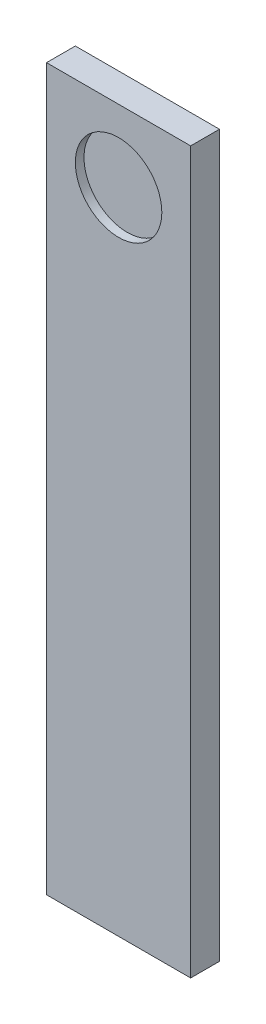
ISO-10303-21;
HEADER;
FILE_DESCRIPTION(('STEP AP214'),'2;1');
FILE_NAME('part.step','',(''),(''),'','','');
FILE_SCHEMA(('AUTOMOTIVE_DESIGN { 1 0 10303 214 1 1 1 1 }'));
ENDSEC;
DATA;
#1=APPLICATION_CONTEXT('core data for automotive mechanical design processes');
#2=APPLICATION_PROTOCOL_DEFINITION('international standard','automotive_design',2000,#1);
#3=PRODUCT_CONTEXT('',#1,'mechanical');
#4=PRODUCT('Part','Part','',(#3));
#5=PRODUCT_RELATED_PRODUCT_CATEGORY('part','',(#4));
#6=PRODUCT_DEFINITION_FORMATION('','',#4);
#7=PRODUCT_DEFINITION_CONTEXT('part definition',#1,'design');
#8=PRODUCT_DEFINITION('design','',#6,#7);
#9=PRODUCT_DEFINITION_SHAPE('','',#8);
#10=(LENGTH_UNIT() NAMED_UNIT(*) SI_UNIT(.MILLI.,.METRE.));
#11=(NAMED_UNIT(*) PLANE_ANGLE_UNIT() SI_UNIT($,.RADIAN.));
#12=(NAMED_UNIT(*) SI_UNIT($,.STERADIAN.) SOLID_ANGLE_UNIT());
#13=UNCERTAINTY_MEASURE_WITH_UNIT(LENGTH_MEASURE(1.E-05),#10,'distance_accuracy_value','');
#14=(GEOMETRIC_REPRESENTATION_CONTEXT(3) GLOBAL_UNCERTAINTY_ASSIGNED_CONTEXT((#13)) GLOBAL_UNIT_ASSIGNED_CONTEXT((#10,
#11,#12)) REPRESENTATION_CONTEXT('',''));
#15=CARTESIAN_POINT('',(0.,0.,0.));
#16=DIRECTION('',(0.,0.,1.));
#17=DIRECTION('',(1.,0.,0.));
#18=AXIS2_PLACEMENT_3D('',#15,#16,#17);
#19=CARTESIAN_POINT('',(25.,125.,5.));
#20=DIRECTION('',(-1.,0.,0.));
#21=DIRECTION('',(0.,-1.,0.));
#22=AXIS2_PLACEMENT_3D('',#19,#20,#21);
#23=PLANE('',#22);
#24=DIRECTION('',(0.,1.,0.));
#25=VECTOR('',#24,1.);
#26=CARTESIAN_POINT('',(25.,125.,-5.));
#27=LINE('',#26,#25);
#28=CARTESIAN_POINT('',(25.,-125.,-5.));
#29=VERTEX_POINT('',#28);
#30=CARTESIAN_POINT('',(25.,125.,-5.));
#31=VERTEX_POINT('',#30);
#32=EDGE_CURVE('E99',#29,#31,#27,.T.);
#33=ORIENTED_EDGE('',*,*,#32,.T.);
#34=DIRECTION('',(0.,0.,-1.));
#35=VECTOR('',#34,1.);
#36=CARTESIAN_POINT('',(25.,125.,5.));
#37=LINE('',#36,#35);
#38=CARTESIAN_POINT('',(25.,125.,5.));
#39=VERTEX_POINT('',#38);
#40=EDGE_CURVE('E11',#39,#31,#37,.T.);
#41=ORIENTED_EDGE('',*,*,#40,.F.);
#42=DIRECTION('',(0.,1.,0.));
#43=VECTOR('',#42,1.);
#44=CARTESIAN_POINT('',(25.,125.,5.));
#45=LINE('',#44,#43);
#46=CARTESIAN_POINT('',(25.,-125.,5.));
#47=VERTEX_POINT('',#46);
#48=EDGE_CURVE('E87',#47,#39,#45,.T.);
#49=ORIENTED_EDGE('',*,*,#48,.F.);
#50=DIRECTION('',(0.,0.,-1.));
#51=VECTOR('',#50,1.);
#52=CARTESIAN_POINT('',(25.,-125.,5.));
#53=LINE('',#52,#51);
#54=EDGE_CURVE('E95',#47,#29,#53,.T.);
#55=ORIENTED_EDGE('',*,*,#54,.T.);
#56=EDGE_LOOP('',(#33,#41,#49,#55));
#57=FACE_BOUND('',#56,.T.);
#58=ADVANCED_FACE('F36',(#57),#23,.F.);
#59=CARTESIAN_POINT('',(-25.,125.,5.));
#60=DIRECTION('',(0.,-1.,0.));
#61=DIRECTION('',(0.,0.,-1.));
#62=AXIS2_PLACEMENT_3D('',#59,#60,#61);
#63=PLANE('',#62);
#64=DIRECTION('',(-1.,0.,0.));
#65=VECTOR('',#64,1.);
#66=CARTESIAN_POINT('',(-25.,125.,-5.));
#67=LINE('',#66,#65);
#68=CARTESIAN_POINT('',(-25.,125.,-5.));
#69=VERTEX_POINT('',#68);
#70=EDGE_CURVE('E91',#31,#69,#67,.T.);
#71=ORIENTED_EDGE('',*,*,#70,.T.);
#72=DIRECTION('',(0.,0.,-1.));
#73=VECTOR('',#72,1.);
#74=CARTESIAN_POINT('',(-25.,125.,5.));
#75=LINE('',#74,#73);
#76=CARTESIAN_POINT('',(-25.,125.,5.));
#77=VERTEX_POINT('',#76);
#78=EDGE_CURVE('E44',#77,#69,#75,.T.);
#79=ORIENTED_EDGE('',*,*,#78,.F.);
#80=DIRECTION('',(-1.,0.,0.));
#81=VECTOR('',#80,1.);
#82=CARTESIAN_POINT('',(-25.,125.,5.));
#83=LINE('',#82,#81);
#84=EDGE_CURVE('E82',#39,#77,#83,.T.);
#85=ORIENTED_EDGE('',*,*,#84,.F.);
#86=ORIENTED_EDGE('',*,*,#40,.T.);
#87=EDGE_LOOP('',(#71,#79,#85,#86));
#88=FACE_BOUND('',#87,.T.);
#89=ADVANCED_FACE('F90',(#88),#63,.F.);
#90=CARTESIAN_POINT('',(-25.,125.,5.));
#91=DIRECTION('',(1.,0.,0.));
#92=DIRECTION('',(0.,1.,0.));
#93=AXIS2_PLACEMENT_3D('',#90,#91,#92);
#94=PLANE('',#93);
#95=DIRECTION('',(0.,-1.,0.));
#96=VECTOR('',#95,1.);
#97=CARTESIAN_POINT('',(-25.,125.,-5.));
#98=LINE('',#97,#96);
#99=CARTESIAN_POINT('',(-25.,-125.,-5.));
#100=VERTEX_POINT('',#99);
#101=EDGE_CURVE('E69',#69,#100,#98,.T.);
#102=ORIENTED_EDGE('',*,*,#101,.T.);
#103=DIRECTION('',(0.,0.,-1.));
#104=VECTOR('',#103,1.);
#105=CARTESIAN_POINT('',(-25.,-125.,5.));
#106=LINE('',#105,#104);
#107=CARTESIAN_POINT('',(-25.,-125.,5.));
#108=VERTEX_POINT('',#107);
#109=EDGE_CURVE('E92',#108,#100,#106,.T.);
#110=ORIENTED_EDGE('',*,*,#109,.F.);
#111=DIRECTION('',(0.,-1.,0.));
#112=VECTOR('',#111,1.);
#113=CARTESIAN_POINT('',(-25.,125.,5.));
#114=LINE('',#113,#112);
#115=EDGE_CURVE('E85',#77,#108,#114,.T.);
#116=ORIENTED_EDGE('',*,*,#115,.F.);
#117=ORIENTED_EDGE('',*,*,#78,.T.);
#118=EDGE_LOOP('',(#102,#110,#116,#117));
#119=FACE_BOUND('',#118,.T.);
#120=ADVANCED_FACE('F93',(#119),#94,.F.);
#121=CARTESIAN_POINT('',(-25.,-125.,5.));
#122=DIRECTION('',(0.,1.,0.));
#123=DIRECTION('',(0.,0.,1.));
#124=AXIS2_PLACEMENT_3D('',#121,#122,#123);
#125=PLANE('',#124);
#126=DIRECTION('',(1.,0.,0.));
#127=VECTOR('',#126,1.);
#128=CARTESIAN_POINT('',(-25.,-125.,-5.));
#129=LINE('',#128,#127);
#130=EDGE_CURVE('E75',#100,#29,#129,.T.);
#131=ORIENTED_EDGE('',*,*,#130,.T.);
#132=ORIENTED_EDGE('',*,*,#54,.F.);
#133=DIRECTION('',(1.,0.,0.));
#134=VECTOR('',#133,1.);
#135=CARTESIAN_POINT('',(-25.,-125.,5.));
#136=LINE('',#135,#134);
#137=EDGE_CURVE('E52',#108,#47,#136,.T.);
#138=ORIENTED_EDGE('',*,*,#137,.F.);
#139=ORIENTED_EDGE('',*,*,#109,.T.);
#140=EDGE_LOOP('',(#131,#132,#138,#139));
#141=FACE_BOUND('',#140,.T.);
#142=ADVANCED_FACE('F107',(#141),#125,.F.);
#143=CARTESIAN_POINT('',(0.,0.,5.));
#144=DIRECTION('',(0.,0.,1.));
#145=DIRECTION('',(1.,0.,0.));
#146=AXIS2_PLACEMENT_3D('',#143,#144,#145);
#147=PLANE('',#146);
#148=CARTESIAN_POINT('',(0.,100.,5.));
#149=DIRECTION('',(0.,0.,1.));
#150=DIRECTION('',(1.,0.,0.));
#151=AXIS2_PLACEMENT_3D('',#148,#149,#150);
#152=CIRCLE('',#151,15.);
#153=CARTESIAN_POINT('',(15.,100.,5.));
#154=VERTEX_POINT('',#153);
#155=EDGE_CURVE('E113',#154,#154,#152,.T.);
#156=ORIENTED_EDGE('',*,*,#155,.F.);
#157=EDGE_LOOP('',(#156));
#158=FACE_BOUND('',#157,.T.);
#159=ORIENTED_EDGE('',*,*,#48,.T.);
#160=ORIENTED_EDGE('',*,*,#84,.T.);
#161=ORIENTED_EDGE('',*,*,#115,.T.);
#162=ORIENTED_EDGE('',*,*,#137,.T.);
#163=EDGE_LOOP('',(#159,#160,#161,#162));
#164=FACE_BOUND('',#163,.T.);
#165=ADVANCED_FACE('F83',(#158,#164),#147,.T.);
#166=CARTESIAN_POINT('',(0.,0.,-5.));
#167=DIRECTION('',(0.,0.,1.));
#168=DIRECTION('',(1.,0.,0.));
#169=AXIS2_PLACEMENT_3D('',#166,#167,#168);
#170=PLANE('',#169);
#171=CARTESIAN_POINT('',(0.,-100.,-5.));
#172=DIRECTION('',(0.,0.,-1.));
#173=DIRECTION('',(-1.,0.,0.));
#174=AXIS2_PLACEMENT_3D('',#171,#172,#173);
#175=CIRCLE('',#174,15.);
#176=CARTESIAN_POINT('',(-15.,-100.,-5.));
#177=VERTEX_POINT('',#176);
#178=EDGE_CURVE('E119',#177,#177,#175,.T.);
#179=ORIENTED_EDGE('',*,*,#178,.F.);
#180=EDGE_LOOP('',(#179));
#181=FACE_BOUND('',#180,.T.);
#182=ORIENTED_EDGE('',*,*,#32,.F.);
#183=ORIENTED_EDGE('',*,*,#130,.F.);
#184=ORIENTED_EDGE('',*,*,#101,.F.);
#185=ORIENTED_EDGE('',*,*,#70,.F.);
#186=EDGE_LOOP('',(#182,#183,#184,#185));
#187=FACE_BOUND('',#186,.T.);
#188=ADVANCED_FACE('F110',(#181,#187),#170,.F.);
#189=CARTESIAN_POINT('',(0.,100.,2.));
#190=DIRECTION('',(0.,0.,1.));
#191=DIRECTION('',(1.,0.,0.));
#192=AXIS2_PLACEMENT_3D('',#189,#190,#191);
#193=CYLINDRICAL_SURFACE('',#192,15.);
#194=CARTESIAN_POINT('',(0.,100.,2.));
#195=DIRECTION('',(0.,0.,1.));
#196=DIRECTION('',(1.,0.,0.));
#197=AXIS2_PLACEMENT_3D('',#194,#195,#196);
#198=CIRCLE('',#197,15.);
#199=CARTESIAN_POINT('',(15.,100.,2.));
#200=VERTEX_POINT('',#199);
#201=EDGE_CURVE('E102',#200,#200,#198,.T.);
#202=ORIENTED_EDGE('',*,*,#201,.F.);
#203=EDGE_LOOP('',(#202));
#204=FACE_BOUND('',#203,.T.);
#205=ORIENTED_EDGE('',*,*,#155,.T.);
#206=EDGE_LOOP('',(#205));
#207=FACE_BOUND('',#206,.T.);
#208=ADVANCED_FACE('F135',(#204,#207),#193,.F.);
#209=CARTESIAN_POINT('',(0.,100.,2.));
#210=DIRECTION('',(0.,0.,1.));
#211=DIRECTION('',(1.,0.,0.));
#212=AXIS2_PLACEMENT_3D('',#209,#210,#211);
#213=PLANE('',#212);
#214=ORIENTED_EDGE('',*,*,#201,.T.);
#215=EDGE_LOOP('',(#214));
#216=FACE_BOUND('',#215,.T.);
#217=ADVANCED_FACE('F130',(#216),#213,.T.);
#218=CARTESIAN_POINT('',(0.,-100.,-2.));
#219=DIRECTION('',(0.,0.,-1.));
#220=DIRECTION('',(-1.,0.,0.));
#221=AXIS2_PLACEMENT_3D('',#218,#219,#220);
#222=CYLINDRICAL_SURFACE('',#221,15.);
#223=CARTESIAN_POINT('',(0.,-100.,-2.));
#224=DIRECTION('',(0.,0.,-1.));
#225=DIRECTION('',(-1.,0.,0.));
#226=AXIS2_PLACEMENT_3D('',#223,#224,#225);
#227=CIRCLE('',#226,15.);
#228=CARTESIAN_POINT('',(-15.,-100.,-2.));
#229=VERTEX_POINT('',#228);
#230=EDGE_CURVE('E116',#229,#229,#227,.T.);
#231=ORIENTED_EDGE('',*,*,#230,.F.);
#232=EDGE_LOOP('',(#231));
#233=FACE_BOUND('',#232,.T.);
#234=ORIENTED_EDGE('',*,*,#178,.T.);
#235=EDGE_LOOP('',(#234));
#236=FACE_BOUND('',#235,.T.);
#237=ADVANCED_FACE('F127',(#233,#236),#222,.F.);
#238=CARTESIAN_POINT('',(0.,-100.,-2.));
#239=DIRECTION('',(0.,0.,-1.));
#240=DIRECTION('',(-1.,0.,0.));
#241=AXIS2_PLACEMENT_3D('',#238,#239,#240);
#242=PLANE('',#241);
#243=ORIENTED_EDGE('',*,*,#230,.T.);
#244=EDGE_LOOP('',(#243));
#245=FACE_BOUND('',#244,.T.);
#246=ADVANCED_FACE('F125',(#245),#242,.T.);
#247=CLOSED_SHELL('',(#58,#89,#120,#142,#165,#188,#208,#217,#237,#246));
#248=MANIFOLD_SOLID_BREP('B2',#247);
#249=ADVANCED_BREP_SHAPE_REPRESENTATION('',(#18,#248),#14);
#250=SHAPE_DEFINITION_REPRESENTATION(#9,#249);
ENDSEC;
END-ISO-10303-21;
